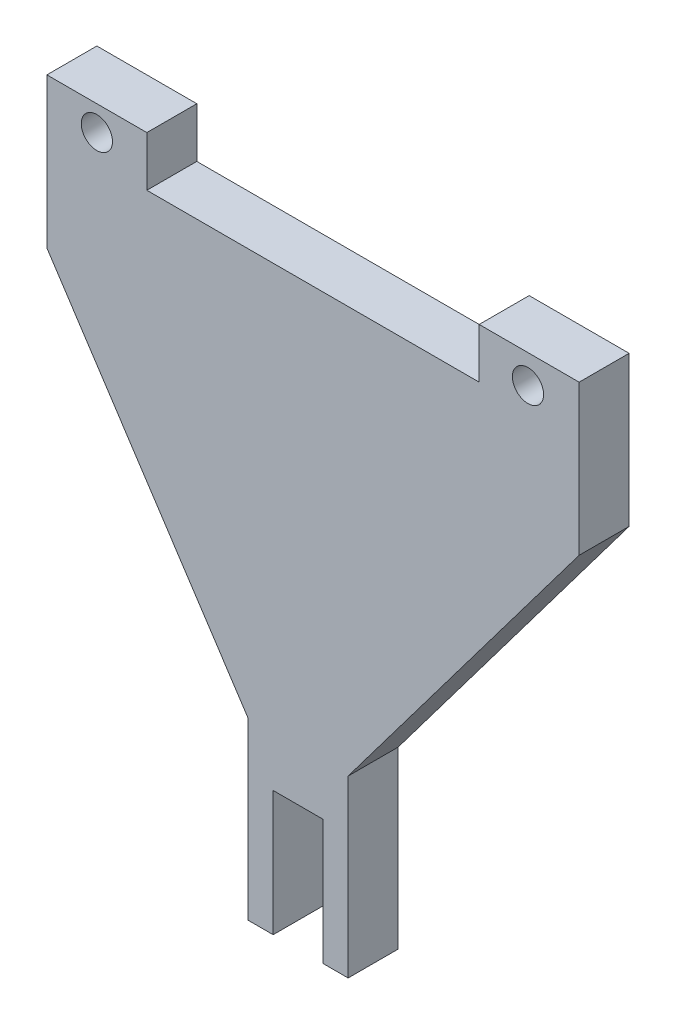
ISO-10303-21;
HEADER;
FILE_DESCRIPTION(('STEP AP214'),'2;1');
FILE_NAME('part.step','',(''),(''),'','','');
FILE_SCHEMA(('AUTOMOTIVE_DESIGN { 1 0 10303 214 1 1 1 1 }'));
ENDSEC;
DATA;
#1=APPLICATION_CONTEXT('core data for automotive mechanical design processes');
#2=APPLICATION_PROTOCOL_DEFINITION('international standard','automotive_design',2000,#1);
#3=PRODUCT_CONTEXT('',#1,'mechanical');
#4=PRODUCT('Part','Part','',(#3));
#5=PRODUCT_RELATED_PRODUCT_CATEGORY('part','',(#4));
#6=PRODUCT_DEFINITION_FORMATION('','',#4);
#7=PRODUCT_DEFINITION_CONTEXT('part definition',#1,'design');
#8=PRODUCT_DEFINITION('design','',#6,#7);
#9=PRODUCT_DEFINITION_SHAPE('','',#8);
#10=(LENGTH_UNIT() NAMED_UNIT(*) SI_UNIT(.MILLI.,.METRE.));
#11=(NAMED_UNIT(*) PLANE_ANGLE_UNIT() SI_UNIT($,.RADIAN.));
#12=(NAMED_UNIT(*) SI_UNIT($,.STERADIAN.) SOLID_ANGLE_UNIT());
#13=UNCERTAINTY_MEASURE_WITH_UNIT(LENGTH_MEASURE(1.E-05),#10,'distance_accuracy_value','');
#14=(GEOMETRIC_REPRESENTATION_CONTEXT(3) GLOBAL_UNCERTAINTY_ASSIGNED_CONTEXT((#13)) GLOBAL_UNIT_ASSIGNED_CONTEXT((#10,
#11,#12)) REPRESENTATION_CONTEXT('',''));
#15=CARTESIAN_POINT('',(0.,0.,0.));
#16=DIRECTION('',(0.,0.,1.));
#17=DIRECTION('',(1.,0.,0.));
#18=AXIS2_PLACEMENT_3D('',#15,#16,#17);
#19=CARTESIAN_POINT('',(27.051,40.64,5.08));
#20=DIRECTION('',(-1.,0.,0.));
#21=DIRECTION('',(0.,-1.,0.));
#22=AXIS2_PLACEMENT_3D('',#19,#20,#21);
#23=PLANE('',#22);
#24=DIRECTION('',(0.,0.,1.));
#25=VECTOR('',#24,1.);
#26=CARTESIAN_POINT('',(27.051,25.4,0.));
#27=LINE('',#26,#25);
#28=CARTESIAN_POINT('',(27.051,25.4,0.));
#29=VERTEX_POINT('',#28);
#30=CARTESIAN_POINT('',(27.051,25.4,5.08));
#31=VERTEX_POINT('',#30);
#32=EDGE_CURVE('E195',#29,#31,#27,.T.);
#33=ORIENTED_EDGE('',*,*,#32,.F.);
#34=DIRECTION('',(0.,1.,0.));
#35=VECTOR('',#34,1.);
#36=CARTESIAN_POINT('',(27.051,40.64,0.));
#37=LINE('',#36,#35);
#38=CARTESIAN_POINT('',(27.051,40.64,0.));
#39=VERTEX_POINT('',#38);
#40=EDGE_CURVE('E173',#29,#39,#37,.T.);
#41=ORIENTED_EDGE('',*,*,#40,.T.);
#42=DIRECTION('',(0.,0.,-1.));
#43=VECTOR('',#42,1.);
#44=CARTESIAN_POINT('',(27.051,40.64,5.08));
#45=LINE('',#44,#43);
#46=CARTESIAN_POINT('',(27.051,40.64,5.08));
#47=VERTEX_POINT('',#46);
#48=EDGE_CURVE('E278',#47,#39,#45,.T.);
#49=ORIENTED_EDGE('',*,*,#48,.F.);
#50=DIRECTION('',(0.,1.,0.));
#51=VECTOR('',#50,1.);
#52=CARTESIAN_POINT('',(27.051,-40.64,5.08));
#53=LINE('',#52,#51);
#54=EDGE_CURVE('E233',#31,#47,#53,.T.);
#55=ORIENTED_EDGE('',*,*,#54,.F.);
#56=EDGE_LOOP('',(#33,#41,#49,#55));
#57=FACE_BOUND('',#56,.T.);
#58=ADVANCED_FACE('F34',(#57),#23,.F.);
#59=CARTESIAN_POINT('',(1.02888431064337,-3.76310340139813,50.0634));
#60=DIRECTION('',(-1.,0.,0.));
#61=DIRECTION('',(0.,-1.,0.));
#62=AXIS2_PLACEMENT_3D('',#59,#60,#61);
#63=PLANE('',#62);
#64=CARTESIAN_POINT('',(1.02888431064336,-167.213272032967,53.13122308931));
#65=DIRECTION('',(1.,0.,0.));
#66=DIRECTION('',(0.,1.,0.));
#67=AXIS2_PLACEMENT_3D('',#64,#65,#66);
#68=CIRCLE('',#67,163.576908325644);
#69=CARTESIAN_POINT('',(1.02888431064337,-12.5055538337438,0.));
#70=VERTEX_POINT('',#69);
#71=CARTESIAN_POINT('',(1.02888431064337,-10.8531591620764,5.08));
#72=VERTEX_POINT('',#71);
#73=EDGE_CURVE('E197',#70,#72,#68,.T.);
#74=ORIENTED_EDGE('',*,*,#73,.F.);
#75=DIRECTION('',(0.,-1.,0.));
#76=VECTOR('',#75,1.);
#77=CARTESIAN_POINT('',(1.02888431064337,0.,0.));
#78=LINE('',#77,#76);
#79=CARTESIAN_POINT('',(1.02888431064337,-23.5531591620764,0.));
#80=VERTEX_POINT('',#79);
#81=EDGE_CURVE('E11',#70,#80,#78,.T.);
#82=ORIENTED_EDGE('',*,*,#81,.T.);
#83=DIRECTION('',(0.,0.,1.));
#84=VECTOR('',#83,1.);
#85=CARTESIAN_POINT('',(1.02888431064337,-23.5531591620764,0.));
#86=LINE('',#85,#84);
#87=CARTESIAN_POINT('',(1.02888431064337,-23.5531591620764,5.08));
#88=VERTEX_POINT('',#87);
#89=EDGE_CURVE('E207',#80,#88,#86,.T.);
#90=ORIENTED_EDGE('',*,*,#89,.T.);
#91=DIRECTION('',(0.,-1.,0.));
#92=VECTOR('',#91,1.);
#93=CARTESIAN_POINT('',(1.02888431064337,0.,5.08));
#94=LINE('',#93,#92);
#95=EDGE_CURVE('E48',#72,#88,#94,.T.);
#96=ORIENTED_EDGE('',*,*,#95,.F.);
#97=EDGE_LOOP('',(#74,#82,#90,#96));
#98=FACE_BOUND('',#97,.T.);
#99=ADVANCED_FACE('F293',(#98),#63,.T.);
#100=CARTESIAN_POINT('',(0.,0.,5.08));
#101=DIRECTION('',(0.,0.,1.));
#102=DIRECTION('',(1.,0.,0.));
#103=AXIS2_PLACEMENT_3D('',#100,#101,#102);
#104=PLANE('',#103);
#105=DIRECTION('',(-0.548703278295492,0.836017172304361,0.));
#106=VECTOR('',#105,1.);
#107=CARTESIAN_POINT('',(-7.2549881706717,-4.76166749334822,5.08));
#108=LINE('',#107,#106);
#109=CARTESIAN_POINT('',(-6.59111568935663,-5.77315916207636,5.08));
#110=VERTEX_POINT('',#109);
#111=CARTESIAN_POINT('',(-27.051,25.4,5.08));
#112=VERTEX_POINT('',#111);
#113=EDGE_CURVE('E174',#110,#112,#108,.T.);
#114=ORIENTED_EDGE('',*,*,#113,.F.);
#115=DIRECTION('',(0.,1.,0.));
#116=VECTOR('',#115,1.);
#117=CARTESIAN_POINT('',(-6.59111568935663,0.,5.08));
#118=LINE('',#117,#116);
#119=CARTESIAN_POINT('',(-6.59111568935663,-23.5531591620764,5.08));
#120=VERTEX_POINT('',#119);
#121=EDGE_CURVE('E176',#120,#110,#118,.T.);
#122=ORIENTED_EDGE('',*,*,#121,.F.);
#123=DIRECTION('',(-1.,0.,0.));
#124=VECTOR('',#123,1.);
#125=CARTESIAN_POINT('',(0.,-23.5531591620764,5.08));
#126=LINE('',#125,#124);
#127=CARTESIAN_POINT('',(-4.05111568935663,-23.5531591620764,5.08));
#128=VERTEX_POINT('',#127);
#129=EDGE_CURVE('E190',#128,#120,#126,.T.);
#130=ORIENTED_EDGE('',*,*,#129,.F.);
#131=DIRECTION('',(0.,1.,0.));
#132=VECTOR('',#131,1.);
#133=CARTESIAN_POINT('',(-4.05111568935663,0.,5.08));
#134=LINE('',#133,#132);
#135=CARTESIAN_POINT('',(-4.05111568935663,-10.8531591620764,5.08));
#136=VERTEX_POINT('',#135);
#137=EDGE_CURVE('E218',#128,#136,#134,.T.);
#138=ORIENTED_EDGE('',*,*,#137,.T.);
#139=DIRECTION('',(1.,0.,0.));
#140=VECTOR('',#139,1.);
#141=CARTESIAN_POINT('',(-4.05111568935663,-10.8531591620764,5.08));
#142=LINE('',#141,#140);
#143=EDGE_CURVE('E215',#72,#136,#142,.F.);
#144=ORIENTED_EDGE('',*,*,#143,.F.);
#145=ORIENTED_EDGE('',*,*,#95,.T.);
#146=DIRECTION('',(1.,0.,0.));
#147=VECTOR('',#146,1.);
#148=CARTESIAN_POINT('',(0.,-23.5531591620764,5.08));
#149=LINE('',#148,#147);
#150=CARTESIAN_POINT('',(3.56888431064337,-23.5531591620764,5.08));
#151=VERTEX_POINT('',#150);
#152=EDGE_CURVE('E188',#88,#151,#149,.T.);
#153=ORIENTED_EDGE('',*,*,#152,.T.);
#154=DIRECTION('',(0.,1.,0.));
#155=VECTOR('',#154,1.);
#156=CARTESIAN_POINT('',(3.56888431064337,0.,5.08));
#157=LINE('',#156,#155);
#158=CARTESIAN_POINT('',(3.56888431064337,-5.77315916207636,5.08));
#159=VERTEX_POINT('',#158);
#160=EDGE_CURVE('E186',#151,#159,#157,.T.);
#161=ORIENTED_EDGE('',*,*,#160,.T.);
#162=DIRECTION('',(0.601675371775552,0.798740725766974,0.));
#163=VECTOR('',#162,1.);
#164=CARTESIAN_POINT('',(5.05138086560903,-3.805103912007,5.08));
#165=LINE('',#164,#163);
#166=EDGE_CURVE('E165',#159,#31,#165,.T.);
#167=ORIENTED_EDGE('',*,*,#166,.T.);
#168=ORIENTED_EDGE('',*,*,#54,.T.);
#169=DIRECTION('',(-1.,0.,0.));
#170=VECTOR('',#169,1.);
#171=CARTESIAN_POINT('',(27.051,40.64,5.08));
#172=LINE('',#171,#170);
#173=CARTESIAN_POINT('',(16.891,40.64,5.08));
#174=VERTEX_POINT('',#173);
#175=EDGE_CURVE('E235',#47,#174,#172,.T.);
#176=ORIENTED_EDGE('',*,*,#175,.T.);
#177=DIRECTION('',(0.,-1.,0.));
#178=VECTOR('',#177,1.);
#179=CARTESIAN_POINT('',(16.891,40.64,5.08));
#180=LINE('',#179,#178);
#181=CARTESIAN_POINT('',(16.891,35.56,5.08));
#182=VERTEX_POINT('',#181);
#183=EDGE_CURVE('E238',#174,#182,#180,.T.);
#184=ORIENTED_EDGE('',*,*,#183,.T.);
#185=DIRECTION('',(-1.,0.,0.));
#186=VECTOR('',#185,1.);
#187=CARTESIAN_POINT('',(-16.891,35.56,5.08));
#188=LINE('',#187,#186);
#189=CARTESIAN_POINT('',(-16.891,35.56,5.08));
#190=VERTEX_POINT('',#189);
#191=EDGE_CURVE('E240',#182,#190,#188,.T.);
#192=ORIENTED_EDGE('',*,*,#191,.T.);
#193=DIRECTION('',(0.,1.,0.));
#194=VECTOR('',#193,1.);
#195=CARTESIAN_POINT('',(-16.891,40.64,5.08));
#196=LINE('',#195,#194);
#197=CARTESIAN_POINT('',(-16.891,40.64,5.08));
#198=VERTEX_POINT('',#197);
#199=EDGE_CURVE('E242',#190,#198,#196,.T.);
#200=ORIENTED_EDGE('',*,*,#199,.T.);
#201=DIRECTION('',(-1.,0.,0.));
#202=VECTOR('',#201,1.);
#203=CARTESIAN_POINT('',(-27.051,40.64,5.08));
#204=LINE('',#203,#202);
#205=CARTESIAN_POINT('',(-27.051,40.64,5.08));
#206=VERTEX_POINT('',#205);
#207=EDGE_CURVE('E244',#198,#206,#204,.T.);
#208=ORIENTED_EDGE('',*,*,#207,.T.);
#209=DIRECTION('',(0.,-1.,0.));
#210=VECTOR('',#209,1.);
#211=CARTESIAN_POINT('',(-27.051,40.64,5.08));
#212=LINE('',#211,#210);
#213=EDGE_CURVE('E246',#206,#112,#212,.T.);
#214=ORIENTED_EDGE('',*,*,#213,.T.);
#215=EDGE_LOOP('',(#114,#122,#130,#138,#144,#145,#153,#161,#167,#168,#176,#184,#192,#200,#208,#214));
#216=FACE_BOUND('',#215,.T.);
#217=CARTESIAN_POINT('',(-21.971,38.1,5.08));
#218=DIRECTION('',(0.,0.,1.));
#219=DIRECTION('',(1.,0.,0.));
#220=AXIS2_PLACEMENT_3D('',#217,#218,#219);
#221=CIRCLE('',#220,1.5875);
#222=CARTESIAN_POINT('',(-20.3835,38.1,5.08));
#223=VERTEX_POINT('',#222);
#224=EDGE_CURVE('E225',#223,#223,#221,.T.);
#225=ORIENTED_EDGE('',*,*,#224,.F.);
#226=EDGE_LOOP('',(#225));
#227=FACE_BOUND('',#226,.T.);
#228=CARTESIAN_POINT('',(21.8511818454124,37.7412991391645,5.08));
#229=DIRECTION('',(0.,0.,-1.));
#230=DIRECTION('',(-1.,0.,0.));
#231=AXIS2_PLACEMENT_3D('',#228,#229,#230);
#232=CIRCLE('',#231,1.5875);
#233=CARTESIAN_POINT('',(20.2636818454124,37.7412991391645,5.08));
#234=VERTEX_POINT('',#233);
#235=EDGE_CURVE('E222',#234,#234,#232,.T.);
#236=ORIENTED_EDGE('',*,*,#235,.T.);
#237=EDGE_LOOP('',(#236));
#238=FACE_BOUND('',#237,.T.);
#239=ADVANCED_FACE('F295',(#216,#227,#238),#104,.T.);
#240=CARTESIAN_POINT('',(0.,0.,0.));
#241=DIRECTION('',(0.,0.,1.));
#242=DIRECTION('',(1.,0.,0.));
#243=AXIS2_PLACEMENT_3D('',#240,#241,#242);
#244=PLANE('',#243);
#245=CARTESIAN_POINT('',(-21.971,38.1,0.));
#246=DIRECTION('',(0.,0.,1.));
#247=DIRECTION('',(1.,0.,0.));
#248=AXIS2_PLACEMENT_3D('',#245,#246,#247);
#249=CIRCLE('',#248,1.5875);
#250=CARTESIAN_POINT('',(-20.3835,38.1,0.));
#251=VERTEX_POINT('',#250);
#252=EDGE_CURVE('E228',#251,#251,#249,.T.);
#253=ORIENTED_EDGE('',*,*,#252,.T.);
#254=EDGE_LOOP('',(#253));
#255=FACE_BOUND('',#254,.T.);
#256=CARTESIAN_POINT('',(21.8511818454124,37.7412991391645,0.));
#257=DIRECTION('',(0.,0.,-1.));
#258=DIRECTION('',(-1.,0.,0.));
#259=AXIS2_PLACEMENT_3D('',#256,#257,#258);
#260=CIRCLE('',#259,1.5875);
#261=CARTESIAN_POINT('',(20.2636818454124,37.7412991391645,0.));
#262=VERTEX_POINT('',#261);
#263=EDGE_CURVE('E221',#262,#262,#260,.T.);
#264=ORIENTED_EDGE('',*,*,#263,.F.);
#265=EDGE_LOOP('',(#264));
#266=FACE_BOUND('',#265,.T.);
#267=DIRECTION('',(0.,1.,0.));
#268=VECTOR('',#267,1.);
#269=CARTESIAN_POINT('',(-6.59111568935663,0.,0.));
#270=LINE('',#269,#268);
#271=CARTESIAN_POINT('',(-6.59111568935663,-23.5531591620764,0.));
#272=VERTEX_POINT('',#271);
#273=CARTESIAN_POINT('',(-6.59111568935663,-5.77315916207636,0.));
#274=VERTEX_POINT('',#273);
#275=EDGE_CURVE('E181',#272,#274,#270,.T.);
#276=ORIENTED_EDGE('',*,*,#275,.T.);
#277=DIRECTION('',(-0.548703278295492,0.836017172304361,0.));
#278=VECTOR('',#277,1.);
#279=CARTESIAN_POINT('',(-7.2549881706717,-4.76166749334822,0.));
#280=LINE('',#279,#278);
#281=CARTESIAN_POINT('',(-27.051,25.4,0.));
#282=VERTEX_POINT('',#281);
#283=EDGE_CURVE('E167',#274,#282,#280,.T.);
#284=ORIENTED_EDGE('',*,*,#283,.T.);
#285=DIRECTION('',(0.,-1.,0.));
#286=VECTOR('',#285,1.);
#287=CARTESIAN_POINT('',(-27.051,30.48,0.));
#288=LINE('',#287,#286);
#289=CARTESIAN_POINT('',(-27.051,40.64,0.));
#290=VERTEX_POINT('',#289);
#291=EDGE_CURVE('E236',#290,#282,#288,.T.);
#292=ORIENTED_EDGE('',*,*,#291,.F.);
#293=DIRECTION('',(-1.,0.,0.));
#294=VECTOR('',#293,1.);
#295=CARTESIAN_POINT('',(-27.051,40.64,0.));
#296=LINE('',#295,#294);
#297=CARTESIAN_POINT('',(-16.891,40.64,0.));
#298=VERTEX_POINT('',#297);
#299=EDGE_CURVE('E259',#298,#290,#296,.T.);
#300=ORIENTED_EDGE('',*,*,#299,.F.);
#301=DIRECTION('',(0.,1.,0.));
#302=VECTOR('',#301,1.);
#303=CARTESIAN_POINT('',(-16.891,40.64,0.));
#304=LINE('',#303,#302);
#305=CARTESIAN_POINT('',(-16.891,35.56,0.));
#306=VERTEX_POINT('',#305);
#307=EDGE_CURVE('E257',#306,#298,#304,.T.);
#308=ORIENTED_EDGE('',*,*,#307,.F.);
#309=DIRECTION('',(-1.,0.,0.));
#310=VECTOR('',#309,1.);
#311=CARTESIAN_POINT('',(-16.891,35.56,0.));
#312=LINE('',#311,#310);
#313=CARTESIAN_POINT('',(16.891,35.56,0.));
#314=VERTEX_POINT('',#313);
#315=EDGE_CURVE('E255',#314,#306,#312,.T.);
#316=ORIENTED_EDGE('',*,*,#315,.F.);
#317=DIRECTION('',(0.,-1.,0.));
#318=VECTOR('',#317,1.);
#319=CARTESIAN_POINT('',(16.891,40.64,0.));
#320=LINE('',#319,#318);
#321=CARTESIAN_POINT('',(16.891,40.64,0.));
#322=VERTEX_POINT('',#321);
#323=EDGE_CURVE('E253',#322,#314,#320,.T.);
#324=ORIENTED_EDGE('',*,*,#323,.F.);
#325=DIRECTION('',(-1.,0.,0.));
#326=VECTOR('',#325,1.);
#327=CARTESIAN_POINT('',(27.051,40.64,0.));
#328=LINE('',#327,#326);
#329=EDGE_CURVE('E251',#39,#322,#328,.T.);
#330=ORIENTED_EDGE('',*,*,#329,.F.);
#331=ORIENTED_EDGE('',*,*,#40,.F.);
#332=DIRECTION('',(0.601675371775552,0.798740725766974,0.));
#333=VECTOR('',#332,1.);
#334=CARTESIAN_POINT('',(5.05138086560903,-3.805103912007,0.));
#335=LINE('',#334,#333);
#336=CARTESIAN_POINT('',(3.56888431064337,-5.77315916207636,0.));
#337=VERTEX_POINT('',#336);
#338=EDGE_CURVE('E159',#337,#29,#335,.T.);
#339=ORIENTED_EDGE('',*,*,#338,.F.);
#340=DIRECTION('',(0.,1.,0.));
#341=VECTOR('',#340,1.);
#342=CARTESIAN_POINT('',(3.56888431064337,0.,0.));
#343=LINE('',#342,#341);
#344=CARTESIAN_POINT('',(3.56888431064337,-23.5531591620764,0.));
#345=VERTEX_POINT('',#344);
#346=EDGE_CURVE('E148',#345,#337,#343,.T.);
#347=ORIENTED_EDGE('',*,*,#346,.F.);
#348=DIRECTION('',(1.,0.,0.));
#349=VECTOR('',#348,1.);
#350=CARTESIAN_POINT('',(0.,-23.5531591620764,0.));
#351=LINE('',#350,#349);
#352=EDGE_CURVE('E158',#80,#345,#351,.T.);
#353=ORIENTED_EDGE('',*,*,#352,.F.);
#354=ORIENTED_EDGE('',*,*,#81,.F.);
#355=DIRECTION('',(1.,0.,0.));
#356=VECTOR('',#355,1.);
#357=CARTESIAN_POINT('',(-4.05111568935663,-12.5055538337438,0.));
#358=LINE('',#357,#356);
#359=CARTESIAN_POINT('',(-4.05111568935663,-12.5055538337438,0.));
#360=VERTEX_POINT('',#359);
#361=EDGE_CURVE('E281',#70,#360,#358,.F.);
#362=ORIENTED_EDGE('',*,*,#361,.T.);
#363=DIRECTION('',(0.,1.,0.));
#364=VECTOR('',#363,1.);
#365=CARTESIAN_POINT('',(-4.05111568935663,0.,0.));
#366=LINE('',#365,#364);
#367=CARTESIAN_POINT('',(-4.05111568935663,-23.5531591620764,0.));
#368=VERTEX_POINT('',#367);
#369=EDGE_CURVE('E41',#368,#360,#366,.T.);
#370=ORIENTED_EDGE('',*,*,#369,.F.);
#371=DIRECTION('',(-1.,0.,0.));
#372=VECTOR('',#371,1.);
#373=CARTESIAN_POINT('',(0.,-23.5531591620764,0.));
#374=LINE('',#373,#372);
#375=EDGE_CURVE('E56',#368,#272,#374,.T.);
#376=ORIENTED_EDGE('',*,*,#375,.T.);
#377=EDGE_LOOP('',(#276,#284,#292,#300,#308,#316,#324,#330,#331,#339,#347,#353,#354,#362,#370,#376));
#378=FACE_BOUND('',#377,.T.);
#379=ADVANCED_FACE('F171',(#255,#266,#378),#244,.F.);
#380=CARTESIAN_POINT('',(27.051,40.64,5.08));
#381=DIRECTION('',(0.,-1.,0.));
#382=DIRECTION('',(1.,0.,0.));
#383=AXIS2_PLACEMENT_3D('',#380,#381,#382);
#384=PLANE('',#383);
#385=ORIENTED_EDGE('',*,*,#329,.T.);
#386=DIRECTION('',(0.,0.,-1.));
#387=VECTOR('',#386,1.);
#388=CARTESIAN_POINT('',(16.891,40.64,5.08));
#389=LINE('',#388,#387);
#390=EDGE_CURVE('E275',#174,#322,#389,.T.);
#391=ORIENTED_EDGE('',*,*,#390,.F.);
#392=ORIENTED_EDGE('',*,*,#175,.F.);
#393=ORIENTED_EDGE('',*,*,#48,.T.);
#394=EDGE_LOOP('',(#385,#391,#392,#393));
#395=FACE_BOUND('',#394,.T.);
#396=ADVANCED_FACE('F330',(#395),#384,.F.);
#397=CARTESIAN_POINT('',(16.891,40.64,5.08));
#398=DIRECTION('',(1.,0.,0.));
#399=DIRECTION('',(0.,0.,-1.));
#400=AXIS2_PLACEMENT_3D('',#397,#398,#399);
#401=PLANE('',#400);
#402=ORIENTED_EDGE('',*,*,#323,.T.);
#403=DIRECTION('',(0.,0.,-1.));
#404=VECTOR('',#403,1.);
#405=CARTESIAN_POINT('',(16.891,35.56,5.08));
#406=LINE('',#405,#404);
#407=EDGE_CURVE('E272',#182,#314,#406,.T.);
#408=ORIENTED_EDGE('',*,*,#407,.F.);
#409=ORIENTED_EDGE('',*,*,#183,.F.);
#410=ORIENTED_EDGE('',*,*,#390,.T.);
#411=EDGE_LOOP('',(#402,#408,#409,#410));
#412=FACE_BOUND('',#411,.T.);
#413=ADVANCED_FACE('F327',(#412),#401,.F.);
#414=CARTESIAN_POINT('',(-16.891,35.56,5.08));
#415=DIRECTION('',(0.,-1.,0.));
#416=DIRECTION('',(0.,0.,-1.));
#417=AXIS2_PLACEMENT_3D('',#414,#415,#416);
#418=PLANE('',#417);
#419=ORIENTED_EDGE('',*,*,#315,.T.);
#420=DIRECTION('',(0.,0.,-1.));
#421=VECTOR('',#420,1.);
#422=CARTESIAN_POINT('',(-16.891,35.56,5.08));
#423=LINE('',#422,#421);
#424=EDGE_CURVE('E269',#190,#306,#423,.T.);
#425=ORIENTED_EDGE('',*,*,#424,.F.);
#426=ORIENTED_EDGE('',*,*,#191,.F.);
#427=ORIENTED_EDGE('',*,*,#407,.T.);
#428=EDGE_LOOP('',(#419,#425,#426,#427));
#429=FACE_BOUND('',#428,.T.);
#430=ADVANCED_FACE('F323',(#429),#418,.F.);
#431=CARTESIAN_POINT('',(-16.891,40.64,5.08));
#432=DIRECTION('',(-1.,0.,0.));
#433=DIRECTION('',(0.,-1.,0.));
#434=AXIS2_PLACEMENT_3D('',#431,#432,#433);
#435=PLANE('',#434);
#436=ORIENTED_EDGE('',*,*,#307,.T.);
#437=DIRECTION('',(0.,0.,-1.));
#438=VECTOR('',#437,1.);
#439=CARTESIAN_POINT('',(-16.891,40.64,5.08));
#440=LINE('',#439,#438);
#441=EDGE_CURVE('E266',#198,#298,#440,.T.);
#442=ORIENTED_EDGE('',*,*,#441,.F.);
#443=ORIENTED_EDGE('',*,*,#199,.F.);
#444=ORIENTED_EDGE('',*,*,#424,.T.);
#445=EDGE_LOOP('',(#436,#442,#443,#444));
#446=FACE_BOUND('',#445,.T.);
#447=ADVANCED_FACE('F318',(#446),#435,.F.);
#448=CARTESIAN_POINT('',(-27.051,40.64,5.08));
#449=DIRECTION('',(0.,-1.,0.));
#450=DIRECTION('',(1.,0.,0.));
#451=AXIS2_PLACEMENT_3D('',#448,#449,#450);
#452=PLANE('',#451);
#453=ORIENTED_EDGE('',*,*,#299,.T.);
#454=DIRECTION('',(0.,0.,-1.));
#455=VECTOR('',#454,1.);
#456=CARTESIAN_POINT('',(-27.051,40.64,5.08));
#457=LINE('',#456,#455);
#458=EDGE_CURVE('E249',#206,#290,#457,.T.);
#459=ORIENTED_EDGE('',*,*,#458,.F.);
#460=ORIENTED_EDGE('',*,*,#207,.F.);
#461=ORIENTED_EDGE('',*,*,#441,.T.);
#462=EDGE_LOOP('',(#453,#459,#460,#461));
#463=FACE_BOUND('',#462,.T.);
#464=ADVANCED_FACE('F312',(#463),#452,.F.);
#465=CARTESIAN_POINT('',(-27.051,30.48,5.08));
#466=DIRECTION('',(1.,0.,0.));
#467=DIRECTION('',(0.,1.,0.));
#468=AXIS2_PLACEMENT_3D('',#465,#466,#467);
#469=PLANE('',#468);
#470=ORIENTED_EDGE('',*,*,#291,.T.);
#471=DIRECTION('',(0.,0.,1.));
#472=VECTOR('',#471,1.);
#473=CARTESIAN_POINT('',(-27.051,25.4,0.));
#474=LINE('',#473,#472);
#475=EDGE_CURVE('E198',#282,#112,#474,.T.);
#476=ORIENTED_EDGE('',*,*,#475,.T.);
#477=ORIENTED_EDGE('',*,*,#213,.F.);
#478=ORIENTED_EDGE('',*,*,#458,.T.);
#479=EDGE_LOOP('',(#470,#476,#477,#478));
#480=FACE_BOUND('',#479,.T.);
#481=ADVANCED_FACE('F307',(#480),#469,.F.);
#482=CARTESIAN_POINT('',(-21.971,38.1,0.));
#483=DIRECTION('',(0.,0.,1.));
#484=DIRECTION('',(1.,0.,0.));
#485=AXIS2_PLACEMENT_3D('',#482,#483,#484);
#486=CYLINDRICAL_SURFACE('',#485,1.5875);
#487=ORIENTED_EDGE('',*,*,#252,.F.);
#488=EDGE_LOOP('',(#487));
#489=FACE_BOUND('',#488,.T.);
#490=ORIENTED_EDGE('',*,*,#224,.T.);
#491=EDGE_LOOP('',(#490));
#492=FACE_BOUND('',#491,.T.);
#493=ADVANCED_FACE('F364',(#489,#492),#486,.F.);
#494=CARTESIAN_POINT('',(21.8511818454124,37.7412991391645,5.08));
#495=DIRECTION('',(0.,0.,-1.));
#496=DIRECTION('',(-1.,0.,0.));
#497=AXIS2_PLACEMENT_3D('',#494,#495,#496);
#498=CYLINDRICAL_SURFACE('',#497,1.5875);
#499=ORIENTED_EDGE('',*,*,#235,.F.);
#500=EDGE_LOOP('',(#499));
#501=FACE_BOUND('',#500,.T.);
#502=ORIENTED_EDGE('',*,*,#263,.T.);
#503=EDGE_LOOP('',(#502));
#504=FACE_BOUND('',#503,.T.);
#505=ADVANCED_FACE('F362',(#501,#504),#498,.F.);
#506=CARTESIAN_POINT('',(-4.05111568935663,-3.76310340139813,50.0634));
#507=DIRECTION('',(1.,0.,0.));
#508=DIRECTION('',(0.,1.,0.));
#509=AXIS2_PLACEMENT_3D('',#506,#507,#508);
#510=PLANE('',#509);
#511=CARTESIAN_POINT('',(-4.05111568935664,-167.213272032967,53.13122308931));
#512=DIRECTION('',(1.,0.,0.));
#513=DIRECTION('',(0.,1.,0.));
#514=AXIS2_PLACEMENT_3D('',#511,#512,#513);
#515=CIRCLE('',#514,163.576908325644);
#516=EDGE_CURVE('E212',#360,#136,#515,.T.);
#517=ORIENTED_EDGE('',*,*,#516,.T.);
#518=ORIENTED_EDGE('',*,*,#137,.F.);
#519=DIRECTION('',(0.,0.,1.));
#520=VECTOR('',#519,1.);
#521=CARTESIAN_POINT('',(-4.05111568935663,-23.5531591620764,0.));
#522=LINE('',#521,#520);
#523=EDGE_CURVE('E205',#368,#128,#522,.T.);
#524=ORIENTED_EDGE('',*,*,#523,.F.);
#525=ORIENTED_EDGE('',*,*,#369,.T.);
#526=EDGE_LOOP('',(#517,#518,#524,#525));
#527=FACE_BOUND('',#526,.T.);
#528=ADVANCED_FACE('F286',(#527),#510,.T.);
#529=CARTESIAN_POINT('',(-4.05111568935664,-167.213272032967,53.13122308931));
#530=DIRECTION('',(1.,0.,0.));
#531=DIRECTION('',(0.,1.,0.));
#532=AXIS2_PLACEMENT_3D('',#529,#530,#531);
#533=CYLINDRICAL_SURFACE('',#532,163.576908325644);
#534=ORIENTED_EDGE('',*,*,#143,.T.);
#535=ORIENTED_EDGE('',*,*,#516,.F.);
#536=ORIENTED_EDGE('',*,*,#361,.F.);
#537=ORIENTED_EDGE('',*,*,#73,.T.);
#538=EDGE_LOOP('',(#534,#535,#536,#537));
#539=FACE_BOUND('',#538,.T.);
#540=ADVANCED_FACE('F289',(#539),#533,.F.);
#541=CARTESIAN_POINT('',(-7.2549881706717,-4.76166749334822,0.));
#542=DIRECTION('',(0.836017172304361,0.548703278295492,0.));
#543=DIRECTION('',(-0.548703278295492,0.836017172304361,0.));
#544=AXIS2_PLACEMENT_3D('',#541,#542,#543);
#545=PLANE('',#544);
#546=ORIENTED_EDGE('',*,*,#113,.T.);
#547=ORIENTED_EDGE('',*,*,#475,.F.);
#548=ORIENTED_EDGE('',*,*,#283,.F.);
#549=DIRECTION('',(0.,0.,1.));
#550=VECTOR('',#549,1.);
#551=CARTESIAN_POINT('',(-6.59111568935663,-5.77315916207636,0.));
#552=LINE('',#551,#550);
#553=EDGE_CURVE('E201',#274,#110,#552,.T.);
#554=ORIENTED_EDGE('',*,*,#553,.T.);
#555=EDGE_LOOP('',(#546,#547,#548,#554));
#556=FACE_BOUND('',#555,.T.);
#557=ADVANCED_FACE('F445',(#556),#545,.F.);
#558=CARTESIAN_POINT('',(0.,-23.5531591620764,0.));
#559=DIRECTION('',(0.,1.,0.));
#560=DIRECTION('',(0.,0.,1.));
#561=AXIS2_PLACEMENT_3D('',#558,#559,#560);
#562=PLANE('',#561);
#563=ORIENTED_EDGE('',*,*,#129,.T.);
#564=DIRECTION('',(0.,0.,1.));
#565=VECTOR('',#564,1.);
#566=CARTESIAN_POINT('',(-6.59111568935663,-23.5531591620764,0.));
#567=LINE('',#566,#565);
#568=EDGE_CURVE('E203',#272,#120,#567,.T.);
#569=ORIENTED_EDGE('',*,*,#568,.F.);
#570=ORIENTED_EDGE('',*,*,#375,.F.);
#571=ORIENTED_EDGE('',*,*,#523,.T.);
#572=EDGE_LOOP('',(#563,#569,#570,#571));
#573=FACE_BOUND('',#572,.T.);
#574=ADVANCED_FACE('F299',(#573),#562,.F.);
#575=CARTESIAN_POINT('',(-6.59111568935663,0.,0.));
#576=DIRECTION('',(1.,0.,0.));
#577=DIRECTION('',(0.,0.,-1.));
#578=AXIS2_PLACEMENT_3D('',#575,#576,#577);
#579=PLANE('',#578);
#580=ORIENTED_EDGE('',*,*,#121,.T.);
#581=ORIENTED_EDGE('',*,*,#553,.F.);
#582=ORIENTED_EDGE('',*,*,#275,.F.);
#583=ORIENTED_EDGE('',*,*,#568,.T.);
#584=EDGE_LOOP('',(#580,#581,#582,#583));
#585=FACE_BOUND('',#584,.T.);
#586=ADVANCED_FACE('F302',(#585),#579,.F.);
#587=CARTESIAN_POINT('',(5.05138086560903,-3.805103912007,0.));
#588=DIRECTION('',(0.798740725766974,-0.601675371775552,0.));
#589=DIRECTION('',(0.601675371775552,0.798740725766974,0.));
#590=AXIS2_PLACEMENT_3D('',#587,#588,#589);
#591=PLANE('',#590);
#592=ORIENTED_EDGE('',*,*,#166,.F.);
#593=DIRECTION('',(0.,0.,1.));
#594=VECTOR('',#593,1.);
#595=CARTESIAN_POINT('',(3.56888431064337,-5.77315916207636,0.));
#596=LINE('',#595,#594);
#597=EDGE_CURVE('E152',#337,#159,#596,.T.);
#598=ORIENTED_EDGE('',*,*,#597,.F.);
#599=ORIENTED_EDGE('',*,*,#338,.T.);
#600=ORIENTED_EDGE('',*,*,#32,.T.);
#601=EDGE_LOOP('',(#592,#598,#599,#600));
#602=FACE_BOUND('',#601,.T.);
#603=ADVANCED_FACE('F162',(#602),#591,.T.);
#604=CARTESIAN_POINT('',(0.,-23.5531591620764,0.));
#605=DIRECTION('',(0.,-1.,0.));
#606=DIRECTION('',(0.,0.,-1.));
#607=AXIS2_PLACEMENT_3D('',#604,#605,#606);
#608=PLANE('',#607);
#609=ORIENTED_EDGE('',*,*,#152,.F.);
#610=ORIENTED_EDGE('',*,*,#89,.F.);
#611=ORIENTED_EDGE('',*,*,#352,.T.);
#612=DIRECTION('',(0.,0.,1.));
#613=VECTOR('',#612,1.);
#614=CARTESIAN_POINT('',(3.56888431064337,-23.5531591620764,0.));
#615=LINE('',#614,#613);
#616=EDGE_CURVE('E154',#345,#151,#615,.T.);
#617=ORIENTED_EDGE('',*,*,#616,.T.);
#618=EDGE_LOOP('',(#609,#610,#611,#617));
#619=FACE_BOUND('',#618,.T.);
#620=ADVANCED_FACE('F336',(#619),#608,.T.);
#621=CARTESIAN_POINT('',(3.56888431064337,0.,0.));
#622=DIRECTION('',(1.,0.,0.));
#623=DIRECTION('',(0.,0.,-1.));
#624=AXIS2_PLACEMENT_3D('',#621,#622,#623);
#625=PLANE('',#624);
#626=ORIENTED_EDGE('',*,*,#160,.F.);
#627=ORIENTED_EDGE('',*,*,#616,.F.);
#628=ORIENTED_EDGE('',*,*,#346,.T.);
#629=ORIENTED_EDGE('',*,*,#597,.T.);
#630=EDGE_LOOP('',(#626,#627,#628,#629));
#631=FACE_BOUND('',#630,.T.);
#632=ADVANCED_FACE('F151',(#631),#625,.T.);
#633=CLOSED_SHELL('',(#58,#99,#239,#379,#396,#413,#430,#447,#464,#481,#493,#505,#528,#540,#557,
#574,#586,#603,#620,#632));
#634=MANIFOLD_SOLID_BREP('B2',#633);
#635=ADVANCED_BREP_SHAPE_REPRESENTATION('',(#18,#634),#14);
#636=SHAPE_DEFINITION_REPRESENTATION(#9,#635);
ENDSEC;
END-ISO-10303-21;
